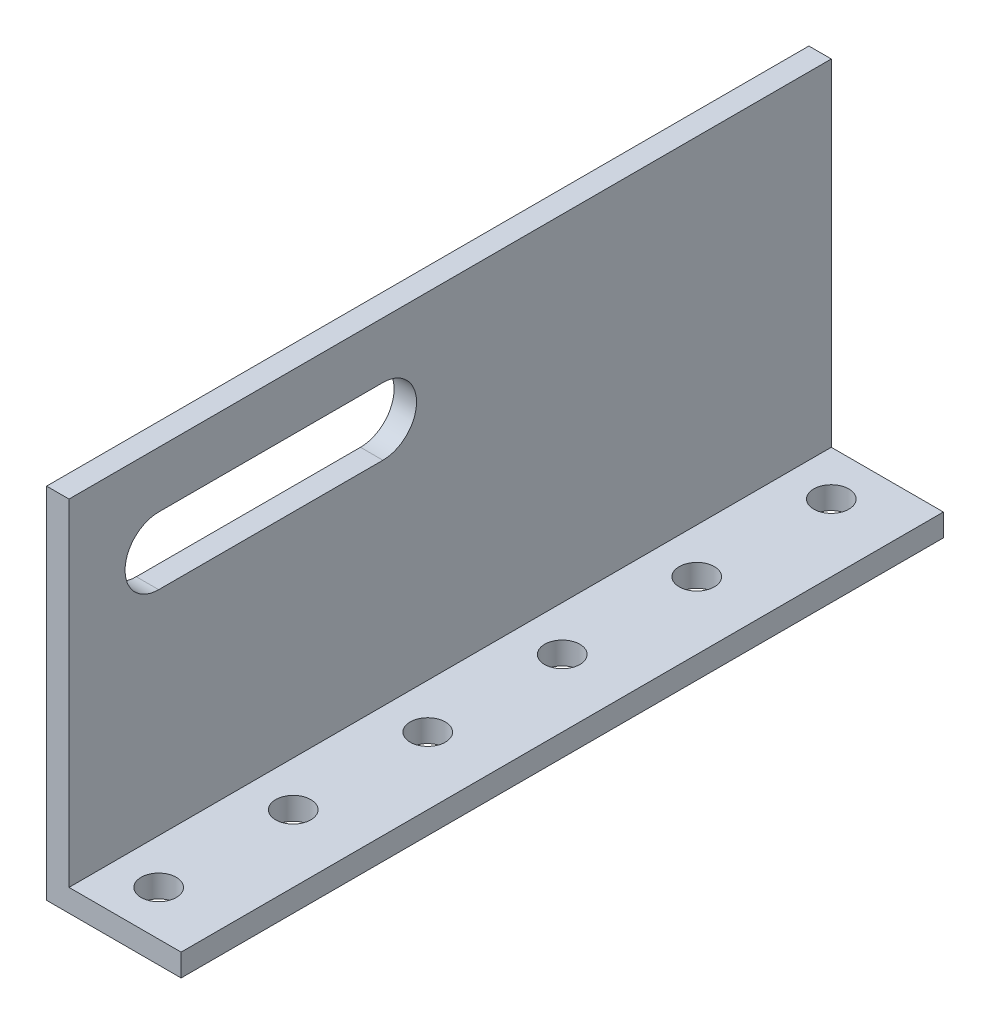
ISO-10303-21;
HEADER;
FILE_DESCRIPTION(('STEP AP214'),'2;1');
FILE_NAME('part.step','',(''),(''),'','','');
FILE_SCHEMA(('AUTOMOTIVE_DESIGN { 1 0 10303 214 1 1 1 1 }'));
ENDSEC;
DATA;
#1=APPLICATION_CONTEXT('core data for automotive mechanical design processes');
#2=APPLICATION_PROTOCOL_DEFINITION('international standard','automotive_design',2000,#1);
#3=PRODUCT_CONTEXT('',#1,'mechanical');
#4=PRODUCT('Part','Part','',(#3));
#5=PRODUCT_RELATED_PRODUCT_CATEGORY('part','',(#4));
#6=PRODUCT_DEFINITION_FORMATION('','',#4);
#7=PRODUCT_DEFINITION_CONTEXT('part definition',#1,'design');
#8=PRODUCT_DEFINITION('design','',#6,#7);
#9=PRODUCT_DEFINITION_SHAPE('','',#8);
#10=(LENGTH_UNIT() NAMED_UNIT(*) SI_UNIT(.MILLI.,.METRE.));
#11=(NAMED_UNIT(*) PLANE_ANGLE_UNIT() SI_UNIT($,.RADIAN.));
#12=(NAMED_UNIT(*) SI_UNIT($,.STERADIAN.) SOLID_ANGLE_UNIT());
#13=UNCERTAINTY_MEASURE_WITH_UNIT(LENGTH_MEASURE(1.E-05),#10,'distance_accuracy_value','');
#14=(GEOMETRIC_REPRESENTATION_CONTEXT(3) GLOBAL_UNCERTAINTY_ASSIGNED_CONTEXT((#13)) GLOBAL_UNIT_ASSIGNED_CONTEXT((#10,
#11,#12)) REPRESENTATION_CONTEXT('',''));
#15=CARTESIAN_POINT('',(0.,0.,0.));
#16=DIRECTION('',(0.,0.,1.));
#17=DIRECTION('',(1.,0.,0.));
#18=AXIS2_PLACEMENT_3D('',#15,#16,#17);
#19=CARTESIAN_POINT('',(0.,0.,107.95));
#20=DIRECTION('',(-1.,0.,0.));
#21=DIRECTION('',(0.,0.,1.));
#22=AXIS2_PLACEMENT_3D('',#19,#20,#21);
#23=PLANE('',#22);
#24=CARTESIAN_POINT('',(0.,38.1,63.5));
#25=DIRECTION('',(-1.,0.,0.));
#26=DIRECTION('',(0.,0.,1.));
#27=AXIS2_PLACEMENT_3D('',#24,#25,#26);
#28=CIRCLE('',#27,4.7625);
#29=CARTESIAN_POINT('',(0.,42.8625,63.5));
#30=VERTEX_POINT('',#29);
#31=CARTESIAN_POINT('',(0.,33.3375,63.5));
#32=VERTEX_POINT('',#31);
#33=EDGE_CURVE('E64',#30,#32,#28,.T.);
#34=ORIENTED_EDGE('',*,*,#33,.F.);
#35=DIRECTION('',(0.,0.,-1.));
#36=VECTOR('',#35,1.);
#37=CARTESIAN_POINT('',(0.,42.8625,63.5));
#38=LINE('',#37,#36);
#39=CARTESIAN_POINT('',(0.,42.8625,95.25));
#40=VERTEX_POINT('',#39);
#41=EDGE_CURVE('E146',#40,#30,#38,.T.);
#42=ORIENTED_EDGE('',*,*,#41,.F.);
#43=CARTESIAN_POINT('',(0.,38.1,95.25));
#44=DIRECTION('',(-1.,0.,0.));
#45=DIRECTION('',(0.,0.,1.));
#46=AXIS2_PLACEMENT_3D('',#43,#44,#45);
#47=CIRCLE('',#46,4.7625);
#48=CARTESIAN_POINT('',(0.,33.3375,95.25));
#49=VERTEX_POINT('',#48);
#50=EDGE_CURVE('E129',#49,#40,#47,.T.);
#51=ORIENTED_EDGE('',*,*,#50,.F.);
#52=DIRECTION('',(0.,0.,1.));
#53=VECTOR('',#52,1.);
#54=CARTESIAN_POINT('',(0.,33.3375,63.5));
#55=LINE('',#54,#53);
#56=EDGE_CURVE('E139',#32,#49,#55,.T.);
#57=ORIENTED_EDGE('',*,*,#56,.F.);
#58=EDGE_LOOP('',(#34,#42,#51,#57));
#59=FACE_BOUND('',#58,.T.);
#60=DIRECTION('',(0.,1.,0.));
#61=VECTOR('',#60,1.);
#62=CARTESIAN_POINT('',(0.,0.,0.));
#63=LINE('',#62,#61);
#64=CARTESIAN_POINT('',(0.,0.,0.));
#65=VERTEX_POINT('',#64);
#66=CARTESIAN_POINT('',(0.,50.8,0.));
#67=VERTEX_POINT('',#66);
#68=EDGE_CURVE('E210',#65,#67,#63,.T.);
#69=ORIENTED_EDGE('',*,*,#68,.F.);
#70=DIRECTION('',(0.,0.,-1.));
#71=VECTOR('',#70,1.);
#72=CARTESIAN_POINT('',(0.,0.,107.95));
#73=LINE('',#72,#71);
#74=CARTESIAN_POINT('',(0.,0.,107.95));
#75=VERTEX_POINT('',#74);
#76=EDGE_CURVE('E270',#75,#65,#73,.T.);
#77=ORIENTED_EDGE('',*,*,#76,.F.);
#78=DIRECTION('',(0.,1.,0.));
#79=VECTOR('',#78,1.);
#80=CARTESIAN_POINT('',(0.,0.,107.95));
#81=LINE('',#80,#79);
#82=CARTESIAN_POINT('',(0.,50.8,107.95));
#83=VERTEX_POINT('',#82);
#84=EDGE_CURVE('E211',#75,#83,#81,.T.);
#85=ORIENTED_EDGE('',*,*,#84,.T.);
#86=DIRECTION('',(0.,0.,-1.));
#87=VECTOR('',#86,1.);
#88=CARTESIAN_POINT('',(0.,50.8,107.95));
#89=LINE('',#88,#87);
#90=EDGE_CURVE('E233',#83,#67,#89,.T.);
#91=ORIENTED_EDGE('',*,*,#90,.T.);
#92=EDGE_LOOP('',(#69,#77,#85,#91));
#93=FACE_BOUND('',#92,.T.);
#94=ADVANCED_FACE('F49',(#59,#93),#23,.T.);
#95=CARTESIAN_POINT('',(0.,0.,107.95));
#96=DIRECTION('',(0.,1.,0.));
#97=DIRECTION('',(0.,0.,1.));
#98=AXIS2_PLACEMENT_3D('',#95,#96,#97);
#99=PLANE('',#98);
#100=CARTESIAN_POINT('',(9.525,0.,6.34999999999999));
#101=DIRECTION('',(0.,1.,0.));
#102=DIRECTION('',(0.,0.,1.));
#103=AXIS2_PLACEMENT_3D('',#100,#101,#102);
#104=CIRCLE('',#103,2.4892);
#105=CARTESIAN_POINT('',(9.525,0.,8.83919999999999));
#106=VERTEX_POINT('',#105);
#107=EDGE_CURVE('E206',#106,#106,#104,.T.);
#108=ORIENTED_EDGE('',*,*,#107,.T.);
#109=EDGE_LOOP('',(#108));
#110=FACE_BOUND('',#109,.T.);
#111=CARTESIAN_POINT('',(9.525,0.,25.4));
#112=DIRECTION('',(0.,1.,0.));
#113=DIRECTION('',(0.,0.,1.));
#114=AXIS2_PLACEMENT_3D('',#111,#112,#113);
#115=CIRCLE('',#114,2.4892);
#116=CARTESIAN_POINT('',(9.525,0.,27.8892));
#117=VERTEX_POINT('',#116);
#118=EDGE_CURVE('E202',#117,#117,#115,.T.);
#119=ORIENTED_EDGE('',*,*,#118,.T.);
#120=EDGE_LOOP('',(#119));
#121=FACE_BOUND('',#120,.T.);
#122=CARTESIAN_POINT('',(9.525,0.,44.45));
#123=DIRECTION('',(0.,1.,0.));
#124=DIRECTION('',(0.,0.,1.));
#125=AXIS2_PLACEMENT_3D('',#122,#123,#124);
#126=CIRCLE('',#125,2.4892);
#127=CARTESIAN_POINT('',(9.525,0.,46.9392));
#128=VERTEX_POINT('',#127);
#129=EDGE_CURVE('E198',#128,#128,#126,.T.);
#130=ORIENTED_EDGE('',*,*,#129,.T.);
#131=EDGE_LOOP('',(#130));
#132=FACE_BOUND('',#131,.T.);
#133=CARTESIAN_POINT('',(9.525,0.,63.5));
#134=DIRECTION('',(0.,1.,0.));
#135=DIRECTION('',(0.,0.,1.));
#136=AXIS2_PLACEMENT_3D('',#133,#134,#135);
#137=CIRCLE('',#136,2.4892);
#138=CARTESIAN_POINT('',(9.525,0.,65.9892));
#139=VERTEX_POINT('',#138);
#140=EDGE_CURVE('E194',#139,#139,#137,.T.);
#141=ORIENTED_EDGE('',*,*,#140,.T.);
#142=EDGE_LOOP('',(#141));
#143=FACE_BOUND('',#142,.T.);
#144=CARTESIAN_POINT('',(9.525,0.,82.55));
#145=DIRECTION('',(0.,1.,0.));
#146=DIRECTION('',(0.,0.,1.));
#147=AXIS2_PLACEMENT_3D('',#144,#145,#146);
#148=CIRCLE('',#147,2.4892);
#149=CARTESIAN_POINT('',(9.525,0.,85.0392));
#150=VERTEX_POINT('',#149);
#151=EDGE_CURVE('E190',#150,#150,#148,.T.);
#152=ORIENTED_EDGE('',*,*,#151,.T.);
#153=EDGE_LOOP('',(#152));
#154=FACE_BOUND('',#153,.T.);
#155=CARTESIAN_POINT('',(9.525,0.,101.6));
#156=DIRECTION('',(0.,1.,0.));
#157=DIRECTION('',(0.,0.,1.));
#158=AXIS2_PLACEMENT_3D('',#155,#156,#157);
#159=CIRCLE('',#158,2.4892);
#160=CARTESIAN_POINT('',(9.525,0.,104.0892));
#161=VERTEX_POINT('',#160);
#162=EDGE_CURVE('E167',#161,#161,#159,.T.);
#163=ORIENTED_EDGE('',*,*,#162,.T.);
#164=EDGE_LOOP('',(#163));
#165=FACE_BOUND('',#164,.T.);
#166=DIRECTION('',(1.,0.,0.));
#167=VECTOR('',#166,1.);
#168=CARTESIAN_POINT('',(0.,0.,0.));
#169=LINE('',#168,#167);
#170=CARTESIAN_POINT('',(19.05,0.,0.));
#171=VERTEX_POINT('',#170);
#172=EDGE_CURVE('E237',#65,#171,#169,.T.);
#173=ORIENTED_EDGE('',*,*,#172,.T.);
#174=DIRECTION('',(0.,0.,-1.));
#175=VECTOR('',#174,1.);
#176=CARTESIAN_POINT('',(19.05,0.,107.95));
#177=LINE('',#176,#175);
#178=CARTESIAN_POINT('',(19.05,0.,107.95));
#179=VERTEX_POINT('',#178);
#180=EDGE_CURVE('E266',#179,#171,#177,.T.);
#181=ORIENTED_EDGE('',*,*,#180,.F.);
#182=DIRECTION('',(1.,0.,0.));
#183=VECTOR('',#182,1.);
#184=CARTESIAN_POINT('',(0.,0.,107.95));
#185=LINE('',#184,#183);
#186=EDGE_CURVE('E215',#75,#179,#185,.T.);
#187=ORIENTED_EDGE('',*,*,#186,.F.);
#188=ORIENTED_EDGE('',*,*,#76,.T.);
#189=EDGE_LOOP('',(#173,#181,#187,#188));
#190=FACE_BOUND('',#189,.T.);
#191=ADVANCED_FACE('F302',(#110,#121,#132,#143,#154,#165,#190),#99,.F.);
#192=CARTESIAN_POINT('',(19.05,0.,107.95));
#193=DIRECTION('',(-1.,0.,0.));
#194=DIRECTION('',(0.,0.,1.));
#195=AXIS2_PLACEMENT_3D('',#192,#193,#194);
#196=PLANE('',#195);
#197=DIRECTION('',(0.,1.,0.));
#198=VECTOR('',#197,1.);
#199=CARTESIAN_POINT('',(19.05,0.,0.));
#200=LINE('',#199,#198);
#201=CARTESIAN_POINT('',(19.05,3.175,0.));
#202=VERTEX_POINT('',#201);
#203=EDGE_CURVE('E240',#171,#202,#200,.T.);
#204=ORIENTED_EDGE('',*,*,#203,.T.);
#205=DIRECTION('',(0.,0.,-1.));
#206=VECTOR('',#205,1.);
#207=CARTESIAN_POINT('',(19.05,3.175,107.95));
#208=LINE('',#207,#206);
#209=CARTESIAN_POINT('',(19.05,3.175,107.95));
#210=VERTEX_POINT('',#209);
#211=EDGE_CURVE('E263',#210,#202,#208,.T.);
#212=ORIENTED_EDGE('',*,*,#211,.F.);
#213=DIRECTION('',(0.,1.,0.));
#214=VECTOR('',#213,1.);
#215=CARTESIAN_POINT('',(19.05,0.,107.95));
#216=LINE('',#215,#214);
#217=EDGE_CURVE('E219',#179,#210,#216,.T.);
#218=ORIENTED_EDGE('',*,*,#217,.F.);
#219=ORIENTED_EDGE('',*,*,#180,.T.);
#220=EDGE_LOOP('',(#204,#212,#218,#219));
#221=FACE_BOUND('',#220,.T.);
#222=ADVANCED_FACE('F306',(#221),#196,.F.);
#223=CARTESIAN_POINT('',(0.,3.175,107.95));
#224=DIRECTION('',(0.,1.,0.));
#225=DIRECTION('',(0.,0.,1.));
#226=AXIS2_PLACEMENT_3D('',#223,#224,#225);
#227=PLANE('',#226);
#228=CARTESIAN_POINT('',(9.525,3.175,6.34999999999999));
#229=DIRECTION('',(0.,1.,0.));
#230=DIRECTION('',(0.,0.,1.));
#231=AXIS2_PLACEMENT_3D('',#228,#229,#230);
#232=CIRCLE('',#231,2.4892);
#233=CARTESIAN_POINT('',(9.525,3.175,8.83919999999999));
#234=VERTEX_POINT('',#233);
#235=EDGE_CURVE('E163',#234,#234,#232,.T.);
#236=ORIENTED_EDGE('',*,*,#235,.F.);
#237=EDGE_LOOP('',(#236));
#238=FACE_BOUND('',#237,.T.);
#239=CARTESIAN_POINT('',(9.525,3.175,25.4));
#240=DIRECTION('',(0.,1.,0.));
#241=DIRECTION('',(0.,0.,1.));
#242=AXIS2_PLACEMENT_3D('',#239,#240,#241);
#243=CIRCLE('',#242,2.4892);
#244=CARTESIAN_POINT('',(9.525,3.175,27.8892));
#245=VERTEX_POINT('',#244);
#246=EDGE_CURVE('E168',#245,#245,#243,.T.);
#247=ORIENTED_EDGE('',*,*,#246,.F.);
#248=EDGE_LOOP('',(#247));
#249=FACE_BOUND('',#248,.T.);
#250=CARTESIAN_POINT('',(9.525,3.175,44.45));
#251=DIRECTION('',(0.,1.,0.));
#252=DIRECTION('',(0.,0.,1.));
#253=AXIS2_PLACEMENT_3D('',#250,#251,#252);
#254=CIRCLE('',#253,2.4892);
#255=CARTESIAN_POINT('',(9.525,3.175,46.9392));
#256=VERTEX_POINT('',#255);
#257=EDGE_CURVE('E172',#256,#256,#254,.T.);
#258=ORIENTED_EDGE('',*,*,#257,.F.);
#259=EDGE_LOOP('',(#258));
#260=FACE_BOUND('',#259,.T.);
#261=CARTESIAN_POINT('',(9.525,3.175,63.5));
#262=DIRECTION('',(0.,1.,0.));
#263=DIRECTION('',(0.,0.,1.));
#264=AXIS2_PLACEMENT_3D('',#261,#262,#263);
#265=CIRCLE('',#264,2.4892);
#266=CARTESIAN_POINT('',(9.525,3.175,65.9892));
#267=VERTEX_POINT('',#266);
#268=EDGE_CURVE('E176',#267,#267,#265,.T.);
#269=ORIENTED_EDGE('',*,*,#268,.F.);
#270=EDGE_LOOP('',(#269));
#271=FACE_BOUND('',#270,.T.);
#272=CARTESIAN_POINT('',(9.525,3.175,82.55));
#273=DIRECTION('',(0.,1.,0.));
#274=DIRECTION('',(0.,0.,1.));
#275=AXIS2_PLACEMENT_3D('',#272,#273,#274);
#276=CIRCLE('',#275,2.4892);
#277=CARTESIAN_POINT('',(9.525,3.175,85.0392));
#278=VERTEX_POINT('',#277);
#279=EDGE_CURVE('E180',#278,#278,#276,.T.);
#280=ORIENTED_EDGE('',*,*,#279,.F.);
#281=EDGE_LOOP('',(#280));
#282=FACE_BOUND('',#281,.T.);
#283=CARTESIAN_POINT('',(9.525,3.175,101.6));
#284=DIRECTION('',(0.,1.,0.));
#285=DIRECTION('',(0.,0.,1.));
#286=AXIS2_PLACEMENT_3D('',#283,#284,#285);
#287=CIRCLE('',#286,2.4892);
#288=CARTESIAN_POINT('',(9.525,3.175,104.0892));
#289=VERTEX_POINT('',#288);
#290=EDGE_CURVE('E158',#289,#289,#287,.T.);
#291=ORIENTED_EDGE('',*,*,#290,.F.);
#292=EDGE_LOOP('',(#291));
#293=FACE_BOUND('',#292,.T.);
#294=DIRECTION('',(1.,0.,0.));
#295=VECTOR('',#294,1.);
#296=CARTESIAN_POINT('',(0.,3.175,0.));
#297=LINE('',#296,#295);
#298=CARTESIAN_POINT('',(3.175,3.175,0.));
#299=VERTEX_POINT('',#298);
#300=EDGE_CURVE('E244',#299,#202,#297,.T.);
#301=ORIENTED_EDGE('',*,*,#300,.F.);
#302=DIRECTION('',(0.,0.,-1.));
#303=VECTOR('',#302,1.);
#304=CARTESIAN_POINT('',(3.175,3.175,107.95));
#305=LINE('',#304,#303);
#306=CARTESIAN_POINT('',(3.175,3.175,107.95));
#307=VERTEX_POINT('',#306);
#308=EDGE_CURVE('E260',#307,#299,#305,.T.);
#309=ORIENTED_EDGE('',*,*,#308,.F.);
#310=DIRECTION('',(1.,0.,0.));
#311=VECTOR('',#310,1.);
#312=CARTESIAN_POINT('',(0.,3.175,107.95));
#313=LINE('',#312,#311);
#314=EDGE_CURVE('E222',#307,#210,#313,.T.);
#315=ORIENTED_EDGE('',*,*,#314,.T.);
#316=ORIENTED_EDGE('',*,*,#211,.T.);
#317=EDGE_LOOP('',(#301,#309,#315,#316));
#318=FACE_BOUND('',#317,.T.);
#319=ADVANCED_FACE('F313',(#238,#249,#260,#271,#282,#293,#318),#227,.T.);
#320=CARTESIAN_POINT('',(3.175,0.,107.95));
#321=DIRECTION('',(-1.,0.,0.));
#322=DIRECTION('',(0.,0.,1.));
#323=AXIS2_PLACEMENT_3D('',#320,#321,#322);
#324=PLANE('',#323);
#325=DIRECTION('',(0.,0.,-1.));
#326=VECTOR('',#325,1.);
#327=CARTESIAN_POINT('',(3.175,42.8625,107.95));
#328=LINE('',#327,#326);
#329=CARTESIAN_POINT('',(3.17500000000001,42.8625,95.25));
#330=VERTEX_POINT('',#329);
#331=CARTESIAN_POINT('',(3.17500000000001,42.8625,63.5));
#332=VERTEX_POINT('',#331);
#333=EDGE_CURVE('E57',#330,#332,#328,.T.);
#334=ORIENTED_EDGE('',*,*,#333,.T.);
#335=CARTESIAN_POINT('',(3.17500000000001,38.1,63.5));
#336=DIRECTION('',(-1.,0.,0.));
#337=DIRECTION('',(0.,0.,1.));
#338=AXIS2_PLACEMENT_3D('',#335,#336,#337);
#339=CIRCLE('',#338,4.7625);
#340=CARTESIAN_POINT('',(3.17500000000001,33.3375,63.5));
#341=VERTEX_POINT('',#340);
#342=EDGE_CURVE('E11',#332,#341,#339,.T.);
#343=ORIENTED_EDGE('',*,*,#342,.T.);
#344=DIRECTION('',(0.,0.,1.));
#345=VECTOR('',#344,1.);
#346=CARTESIAN_POINT('',(3.175,33.3375,107.95));
#347=LINE('',#346,#345);
#348=CARTESIAN_POINT('',(3.175,33.3375,95.25));
#349=VERTEX_POINT('',#348);
#350=EDGE_CURVE('E273',#341,#349,#347,.T.);
#351=ORIENTED_EDGE('',*,*,#350,.T.);
#352=CARTESIAN_POINT('',(3.17500000000001,38.1,95.25));
#353=DIRECTION('',(-1.,0.,0.));
#354=DIRECTION('',(0.,0.,1.));
#355=AXIS2_PLACEMENT_3D('',#352,#353,#354);
#356=CIRCLE('',#355,4.7625);
#357=EDGE_CURVE('E132',#349,#330,#356,.T.);
#358=ORIENTED_EDGE('',*,*,#357,.T.);
#359=EDGE_LOOP('',(#334,#343,#351,#358));
#360=FACE_BOUND('',#359,.T.);
#361=DIRECTION('',(0.,1.,0.));
#362=VECTOR('',#361,1.);
#363=CARTESIAN_POINT('',(3.175,0.,0.));
#364=LINE('',#363,#362);
#365=CARTESIAN_POINT('',(3.175,50.8,0.));
#366=VERTEX_POINT('',#365);
#367=EDGE_CURVE('E248',#299,#366,#364,.T.);
#368=ORIENTED_EDGE('',*,*,#367,.T.);
#369=DIRECTION('',(0.,0.,-1.));
#370=VECTOR('',#369,1.);
#371=CARTESIAN_POINT('',(3.175,50.8,107.95));
#372=LINE('',#371,#370);
#373=CARTESIAN_POINT('',(3.175,50.8,107.95));
#374=VERTEX_POINT('',#373);
#375=EDGE_CURVE('E257',#374,#366,#372,.T.);
#376=ORIENTED_EDGE('',*,*,#375,.F.);
#377=DIRECTION('',(0.,1.,0.));
#378=VECTOR('',#377,1.);
#379=CARTESIAN_POINT('',(3.175,0.,107.95));
#380=LINE('',#379,#378);
#381=EDGE_CURVE('E226',#307,#374,#380,.T.);
#382=ORIENTED_EDGE('',*,*,#381,.F.);
#383=ORIENTED_EDGE('',*,*,#308,.T.);
#384=EDGE_LOOP('',(#368,#376,#382,#383));
#385=FACE_BOUND('',#384,.T.);
#386=ADVANCED_FACE('F282',(#360,#385),#324,.F.);
#387=CARTESIAN_POINT('',(0.,50.8,107.95));
#388=DIRECTION('',(0.,1.,0.));
#389=DIRECTION('',(0.,0.,1.));
#390=AXIS2_PLACEMENT_3D('',#387,#388,#389);
#391=PLANE('',#390);
#392=DIRECTION('',(1.,0.,0.));
#393=VECTOR('',#392,1.);
#394=CARTESIAN_POINT('',(0.,50.8,0.));
#395=LINE('',#394,#393);
#396=EDGE_CURVE('E216',#67,#366,#395,.T.);
#397=ORIENTED_EDGE('',*,*,#396,.F.);
#398=ORIENTED_EDGE('',*,*,#90,.F.);
#399=DIRECTION('',(1.,0.,0.));
#400=VECTOR('',#399,1.);
#401=CARTESIAN_POINT('',(0.,50.8,107.95));
#402=LINE('',#401,#400);
#403=EDGE_CURVE('E229',#83,#374,#402,.T.);
#404=ORIENTED_EDGE('',*,*,#403,.T.);
#405=ORIENTED_EDGE('',*,*,#375,.T.);
#406=EDGE_LOOP('',(#397,#398,#404,#405));
#407=FACE_BOUND('',#406,.T.);
#408=ADVANCED_FACE('F321',(#407),#391,.T.);
#409=CARTESIAN_POINT('',(0.,0.,107.95));
#410=DIRECTION('',(0.,0.,1.));
#411=DIRECTION('',(1.,0.,0.));
#412=AXIS2_PLACEMENT_3D('',#409,#410,#411);
#413=PLANE('',#412);
#414=ORIENTED_EDGE('',*,*,#84,.F.);
#415=ORIENTED_EDGE('',*,*,#186,.T.);
#416=ORIENTED_EDGE('',*,*,#217,.T.);
#417=ORIENTED_EDGE('',*,*,#314,.F.);
#418=ORIENTED_EDGE('',*,*,#381,.T.);
#419=ORIENTED_EDGE('',*,*,#403,.F.);
#420=EDGE_LOOP('',(#414,#415,#416,#417,#418,#419));
#421=FACE_BOUND('',#420,.T.);
#422=ADVANCED_FACE('F324',(#421),#413,.T.);
#423=CARTESIAN_POINT('',(0.,0.,0.));
#424=DIRECTION('',(0.,0.,1.));
#425=DIRECTION('',(1.,0.,0.));
#426=AXIS2_PLACEMENT_3D('',#423,#424,#425);
#427=PLANE('',#426);
#428=ORIENTED_EDGE('',*,*,#68,.T.);
#429=ORIENTED_EDGE('',*,*,#396,.T.);
#430=ORIENTED_EDGE('',*,*,#367,.F.);
#431=ORIENTED_EDGE('',*,*,#300,.T.);
#432=ORIENTED_EDGE('',*,*,#203,.F.);
#433=ORIENTED_EDGE('',*,*,#172,.F.);
#434=EDGE_LOOP('',(#428,#429,#430,#431,#432,#433));
#435=FACE_BOUND('',#434,.T.);
#436=ADVANCED_FACE('F326',(#435),#427,.F.);
#437=CARTESIAN_POINT('',(9.525,-104.775,101.6));
#438=DIRECTION('',(0.,1.,0.));
#439=DIRECTION('',(0.,0.,1.));
#440=AXIS2_PLACEMENT_3D('',#437,#438,#439);
#441=CYLINDRICAL_SURFACE('',#440,2.4892);
#442=ORIENTED_EDGE('',*,*,#290,.T.);
#443=EDGE_LOOP('',(#442));
#444=FACE_BOUND('',#443,.T.);
#445=ORIENTED_EDGE('',*,*,#162,.F.);
#446=EDGE_LOOP('',(#445));
#447=FACE_BOUND('',#446,.T.);
#448=ADVANCED_FACE('F328',(#444,#447),#441,.F.);
#449=CARTESIAN_POINT('',(9.525,-104.775,82.55));
#450=DIRECTION('',(0.,1.,0.));
#451=DIRECTION('',(0.,0.,1.));
#452=AXIS2_PLACEMENT_3D('',#449,#450,#451);
#453=CYLINDRICAL_SURFACE('',#452,2.4892);
#454=ORIENTED_EDGE('',*,*,#279,.T.);
#455=EDGE_LOOP('',(#454));
#456=FACE_BOUND('',#455,.T.);
#457=ORIENTED_EDGE('',*,*,#151,.F.);
#458=EDGE_LOOP('',(#457));
#459=FACE_BOUND('',#458,.T.);
#460=ADVANCED_FACE('F335',(#456,#459),#453,.F.);
#461=CARTESIAN_POINT('',(9.525,-104.775,63.5));
#462=DIRECTION('',(0.,1.,0.));
#463=DIRECTION('',(0.,0.,1.));
#464=AXIS2_PLACEMENT_3D('',#461,#462,#463);
#465=CYLINDRICAL_SURFACE('',#464,2.4892);
#466=ORIENTED_EDGE('',*,*,#268,.T.);
#467=EDGE_LOOP('',(#466));
#468=FACE_BOUND('',#467,.T.);
#469=ORIENTED_EDGE('',*,*,#140,.F.);
#470=EDGE_LOOP('',(#469));
#471=FACE_BOUND('',#470,.T.);
#472=ADVANCED_FACE('F339',(#468,#471),#465,.F.);
#473=CARTESIAN_POINT('',(9.525,-104.775,44.45));
#474=DIRECTION('',(0.,1.,0.));
#475=DIRECTION('',(0.,0.,1.));
#476=AXIS2_PLACEMENT_3D('',#473,#474,#475);
#477=CYLINDRICAL_SURFACE('',#476,2.4892);
#478=ORIENTED_EDGE('',*,*,#257,.T.);
#479=EDGE_LOOP('',(#478));
#480=FACE_BOUND('',#479,.T.);
#481=ORIENTED_EDGE('',*,*,#129,.F.);
#482=EDGE_LOOP('',(#481));
#483=FACE_BOUND('',#482,.T.);
#484=ADVANCED_FACE('F343',(#480,#483),#477,.F.);
#485=CARTESIAN_POINT('',(9.525,-104.775,25.4));
#486=DIRECTION('',(0.,1.,0.));
#487=DIRECTION('',(0.,0.,1.));
#488=AXIS2_PLACEMENT_3D('',#485,#486,#487);
#489=CYLINDRICAL_SURFACE('',#488,2.4892);
#490=ORIENTED_EDGE('',*,*,#246,.T.);
#491=EDGE_LOOP('',(#490));
#492=FACE_BOUND('',#491,.T.);
#493=ORIENTED_EDGE('',*,*,#118,.F.);
#494=EDGE_LOOP('',(#493));
#495=FACE_BOUND('',#494,.T.);
#496=ADVANCED_FACE('F297',(#492,#495),#489,.F.);
#497=CARTESIAN_POINT('',(9.525,-104.775,6.34999999999999));
#498=DIRECTION('',(0.,1.,0.));
#499=DIRECTION('',(0.,0.,1.));
#500=AXIS2_PLACEMENT_3D('',#497,#498,#499);
#501=CYLINDRICAL_SURFACE('',#500,2.4892);
#502=ORIENTED_EDGE('',*,*,#235,.T.);
#503=EDGE_LOOP('',(#502));
#504=FACE_BOUND('',#503,.T.);
#505=ORIENTED_EDGE('',*,*,#107,.F.);
#506=EDGE_LOOP('',(#505));
#507=FACE_BOUND('',#506,.T.);
#508=ADVANCED_FACE('F289',(#504,#507),#501,.F.);
#509=CARTESIAN_POINT('',(165.1,38.1,63.5));
#510=DIRECTION('',(-1.,0.,0.));
#511=DIRECTION('',(0.,0.,1.));
#512=AXIS2_PLACEMENT_3D('',#509,#510,#511);
#513=CYLINDRICAL_SURFACE('',#512,4.7625);
#514=DIRECTION('',(-1.,0.,0.));
#515=VECTOR('',#514,1.);
#516=CARTESIAN_POINT('',(165.1,42.8625,63.5));
#517=LINE('',#516,#515);
#518=EDGE_CURVE('E155',#332,#30,#517,.T.);
#519=ORIENTED_EDGE('',*,*,#518,.T.);
#520=ORIENTED_EDGE('',*,*,#33,.T.);
#521=DIRECTION('',(-1.,0.,0.));
#522=VECTOR('',#521,1.);
#523=CARTESIAN_POINT('',(165.1,33.3375,63.5));
#524=LINE('',#523,#522);
#525=EDGE_CURVE('E136',#341,#32,#524,.T.);
#526=ORIENTED_EDGE('',*,*,#525,.F.);
#527=ORIENTED_EDGE('',*,*,#342,.F.);
#528=EDGE_LOOP('',(#519,#520,#526,#527));
#529=FACE_BOUND('',#528,.T.);
#530=ADVANCED_FACE('F287',(#529),#513,.F.);
#531=CARTESIAN_POINT('',(165.1,42.8625,63.5));
#532=DIRECTION('',(0.,1.,0.));
#533=DIRECTION('',(0.,0.,1.));
#534=AXIS2_PLACEMENT_3D('',#531,#532,#533);
#535=PLANE('',#534);
#536=DIRECTION('',(-1.,0.,0.));
#537=VECTOR('',#536,1.);
#538=CARTESIAN_POINT('',(165.1,42.8625,95.25));
#539=LINE('',#538,#537);
#540=EDGE_CURVE('E135',#330,#40,#539,.T.);
#541=ORIENTED_EDGE('',*,*,#540,.T.);
#542=ORIENTED_EDGE('',*,*,#41,.T.);
#543=ORIENTED_EDGE('',*,*,#518,.F.);
#544=ORIENTED_EDGE('',*,*,#333,.F.);
#545=EDGE_LOOP('',(#541,#542,#543,#544));
#546=FACE_BOUND('',#545,.T.);
#547=ADVANCED_FACE('F286',(#546),#535,.F.);
#548=CARTESIAN_POINT('',(165.1,38.1,95.25));
#549=DIRECTION('',(-1.,0.,0.));
#550=DIRECTION('',(0.,0.,1.));
#551=AXIS2_PLACEMENT_3D('',#548,#549,#550);
#552=CYLINDRICAL_SURFACE('',#551,4.7625);
#553=DIRECTION('',(-1.,0.,0.));
#554=VECTOR('',#553,1.);
#555=CARTESIAN_POINT('',(165.1,33.3375,95.25));
#556=LINE('',#555,#554);
#557=EDGE_CURVE('E72',#349,#49,#556,.T.);
#558=ORIENTED_EDGE('',*,*,#557,.T.);
#559=ORIENTED_EDGE('',*,*,#50,.T.);
#560=ORIENTED_EDGE('',*,*,#540,.F.);
#561=ORIENTED_EDGE('',*,*,#357,.F.);
#562=EDGE_LOOP('',(#558,#559,#560,#561));
#563=FACE_BOUND('',#562,.T.);
#564=ADVANCED_FACE('F126',(#563),#552,.F.);
#565=CARTESIAN_POINT('',(165.1,33.3375,63.5));
#566=DIRECTION('',(0.,-1.,0.));
#567=DIRECTION('',(0.,0.,-1.));
#568=AXIS2_PLACEMENT_3D('',#565,#566,#567);
#569=PLANE('',#568);
#570=ORIENTED_EDGE('',*,*,#525,.T.);
#571=ORIENTED_EDGE('',*,*,#56,.T.);
#572=ORIENTED_EDGE('',*,*,#557,.F.);
#573=ORIENTED_EDGE('',*,*,#350,.F.);
#574=EDGE_LOOP('',(#570,#571,#572,#573));
#575=FACE_BOUND('',#574,.T.);
#576=ADVANCED_FACE('F140',(#575),#569,.F.);
#577=CLOSED_SHELL('',(#94,#191,#222,#319,#386,#408,#422,#436,#448,#460,#472,#484,#496,#508,#530,
#547,#564,#576));
#578=MANIFOLD_SOLID_BREP('B2',#577);
#579=ADVANCED_BREP_SHAPE_REPRESENTATION('',(#18,#578),#14);
#580=SHAPE_DEFINITION_REPRESENTATION(#9,#579);
ENDSEC;
END-ISO-10303-21;
